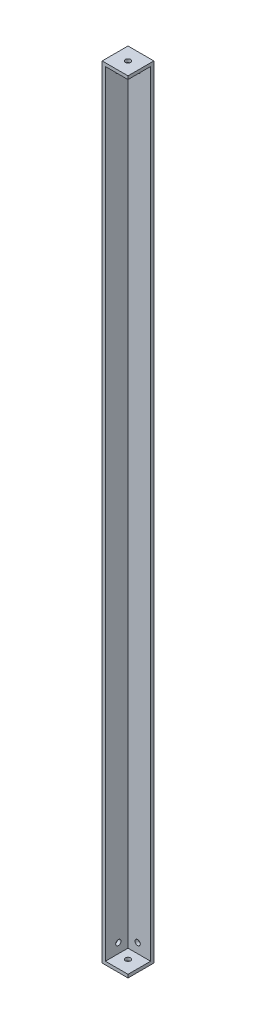
ISO-10303-21;
HEADER;
FILE_DESCRIPTION(('STEP AP214'),'2;1');
FILE_NAME('part.step','',(''),(''),'','','');
FILE_SCHEMA(('AUTOMOTIVE_DESIGN { 1 0 10303 214 1 1 1 1 }'));
ENDSEC;
DATA;
#1=APPLICATION_CONTEXT('core data for automotive mechanical design processes');
#2=APPLICATION_PROTOCOL_DEFINITION('international standard','automotive_design',2000,#1);
#3=PRODUCT_CONTEXT('',#1,'mechanical');
#4=PRODUCT('Part','Part','',(#3));
#5=PRODUCT_RELATED_PRODUCT_CATEGORY('part','',(#4));
#6=PRODUCT_DEFINITION_FORMATION('','',#4);
#7=PRODUCT_DEFINITION_CONTEXT('part definition',#1,'design');
#8=PRODUCT_DEFINITION('design','',#6,#7);
#9=PRODUCT_DEFINITION_SHAPE('','',#8);
#10=(LENGTH_UNIT() NAMED_UNIT(*) SI_UNIT(.MILLI.,.METRE.));
#11=(NAMED_UNIT(*) PLANE_ANGLE_UNIT() SI_UNIT($,.RADIAN.));
#12=(NAMED_UNIT(*) SI_UNIT($,.STERADIAN.) SOLID_ANGLE_UNIT());
#13=UNCERTAINTY_MEASURE_WITH_UNIT(LENGTH_MEASURE(1.E-05),#10,'distance_accuracy_value','');
#14=(GEOMETRIC_REPRESENTATION_CONTEXT(3) GLOBAL_UNCERTAINTY_ASSIGNED_CONTEXT((#13)) GLOBAL_UNIT_ASSIGNED_CONTEXT((#10,
#11,#12)) REPRESENTATION_CONTEXT('',''));
#15=CARTESIAN_POINT('',(0.,0.,0.));
#16=DIRECTION('',(0.,0.,1.));
#17=DIRECTION('',(1.,0.,0.));
#18=AXIS2_PLACEMENT_3D('',#15,#16,#17);
#19=CARTESIAN_POINT('',(0.,5.,0.));
#20=DIRECTION('',(0.,-1.,0.));
#21=DIRECTION('',(0.,0.,-1.));
#22=AXIS2_PLACEMENT_3D('',#19,#20,#21);
#23=PLANE('',#22);
#24=CARTESIAN_POINT('',(0.,5.,0.));
#25=DIRECTION('',(0.,1.,0.));
#26=DIRECTION('',(0.,0.,1.));
#27=AXIS2_PLACEMENT_3D('',#24,#25,#26);
#28=CIRCLE('',#27,4.05);
#29=CARTESIAN_POINT('',(0.,5.,4.05));
#30=VERTEX_POINT('',#29);
#31=EDGE_CURVE('E153',#30,#30,#28,.T.);
#32=ORIENTED_EDGE('',*,*,#31,.F.);
#33=EDGE_LOOP('',(#32));
#34=FACE_BOUND('',#33,.T.);
#35=DIRECTION('',(1.,0.,0.));
#36=VECTOR('',#35,1.);
#37=CARTESIAN_POINT('',(-15.,5.,-15.));
#38=LINE('',#37,#36);
#39=CARTESIAN_POINT('',(-15.,5.,-15.));
#40=VERTEX_POINT('',#39);
#41=CARTESIAN_POINT('',(20.,5.,-15.));
#42=VERTEX_POINT('',#41);
#43=EDGE_CURVE('E142',#40,#42,#38,.T.);
#44=ORIENTED_EDGE('',*,*,#43,.F.);
#45=DIRECTION('',(0.,0.,-1.));
#46=VECTOR('',#45,1.);
#47=CARTESIAN_POINT('',(-15.,5.,20.));
#48=LINE('',#47,#46);
#49=CARTESIAN_POINT('',(-15.,5.,20.));
#50=VERTEX_POINT('',#49);
#51=EDGE_CURVE('E55',#50,#40,#48,.T.);
#52=ORIENTED_EDGE('',*,*,#51,.F.);
#53=DIRECTION('',(1.,0.,0.));
#54=VECTOR('',#53,1.);
#55=CARTESIAN_POINT('',(20.,5.,20.));
#56=LINE('',#55,#54);
#57=CARTESIAN_POINT('',(20.,5.,20.));
#58=VERTEX_POINT('',#57);
#59=EDGE_CURVE('E159',#50,#58,#56,.T.);
#60=ORIENTED_EDGE('',*,*,#59,.T.);
#61=DIRECTION('',(0.,0.,-1.));
#62=VECTOR('',#61,1.);
#63=CARTESIAN_POINT('',(20.,5.,-20.));
#64=LINE('',#63,#62);
#65=EDGE_CURVE('E50',#58,#42,#64,.T.);
#66=ORIENTED_EDGE('',*,*,#65,.T.);
#67=EDGE_LOOP('',(#44,#52,#60,#66));
#68=FACE_BOUND('',#67,.T.);
#69=ADVANCED_FACE('F35',(#34,#68),#23,.F.);
#70=CARTESIAN_POINT('',(-20.,5.,20.));
#71=DIRECTION('',(1.,0.,0.));
#72=DIRECTION('',(0.,0.,-1.));
#73=AXIS2_PLACEMENT_3D('',#70,#71,#72);
#74=PLANE('',#73);
#75=CARTESIAN_POINT('',(-20.,1190.,0.));
#76=DIRECTION('',(-1.,0.,0.));
#77=DIRECTION('',(0.,0.,-1.));
#78=AXIS2_PLACEMENT_3D('',#75,#76,#77);
#79=CIRCLE('',#78,4.05);
#80=CARTESIAN_POINT('',(-20.,1190.,-4.05));
#81=VERTEX_POINT('',#80);
#82=EDGE_CURVE('E313',#81,#81,#79,.T.);
#83=ORIENTED_EDGE('',*,*,#82,.F.);
#84=EDGE_LOOP('',(#83));
#85=FACE_BOUND('',#84,.T.);
#86=CARTESIAN_POINT('',(-20.,20.,0.));
#87=DIRECTION('',(1.,0.,0.));
#88=DIRECTION('',(0.,0.,-1.));
#89=AXIS2_PLACEMENT_3D('',#86,#87,#88);
#90=CIRCLE('',#89,4.05);
#91=CARTESIAN_POINT('',(-20.,20.,-4.05));
#92=VERTEX_POINT('',#91);
#93=EDGE_CURVE('E320',#92,#92,#90,.T.);
#94=ORIENTED_EDGE('',*,*,#93,.T.);
#95=EDGE_LOOP('',(#94));
#96=FACE_BOUND('',#95,.T.);
#97=DIRECTION('',(0.,0.,1.));
#98=VECTOR('',#97,1.);
#99=CARTESIAN_POINT('',(-20.,0.,20.));
#100=LINE('',#99,#98);
#101=CARTESIAN_POINT('',(-20.,0.,-20.));
#102=VERTEX_POINT('',#101);
#103=CARTESIAN_POINT('',(-20.,0.,20.));
#104=VERTEX_POINT('',#103);
#105=EDGE_CURVE('E104',#102,#104,#100,.T.);
#106=ORIENTED_EDGE('',*,*,#105,.T.);
#107=DIRECTION('',(0.,-1.,0.));
#108=VECTOR('',#107,1.);
#109=CARTESIAN_POINT('',(-20.,5.,20.));
#110=LINE('',#109,#108);
#111=CARTESIAN_POINT('',(-20.,1210.,20.));
#112=VERTEX_POINT('',#111);
#113=EDGE_CURVE('E11',#112,#104,#110,.T.);
#114=ORIENTED_EDGE('',*,*,#113,.F.);
#115=DIRECTION('',(0.,0.,1.));
#116=VECTOR('',#115,1.);
#117=CARTESIAN_POINT('',(-20.,1210.,-20.));
#118=LINE('',#117,#116);
#119=CARTESIAN_POINT('',(-20.,1210.,-20.));
#120=VERTEX_POINT('',#119);
#121=EDGE_CURVE('E102',#120,#112,#118,.T.);
#122=ORIENTED_EDGE('',*,*,#121,.F.);
#123=DIRECTION('',(0.,-1.,0.));
#124=VECTOR('',#123,1.);
#125=CARTESIAN_POINT('',(-20.,5.,-20.));
#126=LINE('',#125,#124);
#127=EDGE_CURVE('E163',#120,#102,#126,.T.);
#128=ORIENTED_EDGE('',*,*,#127,.T.);
#129=EDGE_LOOP('',(#106,#114,#122,#128));
#130=FACE_BOUND('',#129,.T.);
#131=ADVANCED_FACE('F37',(#85,#96,#130),#74,.F.);
#132=CARTESIAN_POINT('',(20.,5.,20.));
#133=DIRECTION('',(0.,0.,-1.));
#134=DIRECTION('',(-1.,0.,0.));
#135=AXIS2_PLACEMENT_3D('',#132,#133,#134);
#136=PLANE('',#135);
#137=DIRECTION('',(1.,0.,0.));
#138=VECTOR('',#137,1.);
#139=CARTESIAN_POINT('',(20.,0.,20.));
#140=LINE('',#139,#138);
#141=CARTESIAN_POINT('',(20.,0.,20.));
#142=VERTEX_POINT('',#141);
#143=EDGE_CURVE('E165',#104,#142,#140,.T.);
#144=ORIENTED_EDGE('',*,*,#143,.T.);
#145=DIRECTION('',(0.,-1.,0.));
#146=VECTOR('',#145,1.);
#147=CARTESIAN_POINT('',(20.,5.,20.));
#148=LINE('',#147,#146);
#149=EDGE_CURVE('E43',#58,#142,#148,.T.);
#150=ORIENTED_EDGE('',*,*,#149,.F.);
#151=ORIENTED_EDGE('',*,*,#59,.F.);
#152=DIRECTION('',(0.,-1.,0.));
#153=VECTOR('',#152,1.);
#154=CARTESIAN_POINT('',(-15.,605.,20.));
#155=LINE('',#154,#153);
#156=CARTESIAN_POINT('',(-15.,1205.,20.));
#157=VERTEX_POINT('',#156);
#158=EDGE_CURVE('E150',#157,#50,#155,.T.);
#159=ORIENTED_EDGE('',*,*,#158,.F.);
#160=DIRECTION('',(1.,0.,0.));
#161=VECTOR('',#160,1.);
#162=CARTESIAN_POINT('',(-20.,1205.,20.));
#163=LINE('',#162,#161);
#164=CARTESIAN_POINT('',(20.,1205.,20.));
#165=VERTEX_POINT('',#164);
#166=EDGE_CURVE('E124',#157,#165,#163,.T.);
#167=ORIENTED_EDGE('',*,*,#166,.T.);
#168=DIRECTION('',(0.,-1.,0.));
#169=VECTOR('',#168,1.);
#170=CARTESIAN_POINT('',(20.,1210.,20.));
#171=LINE('',#170,#169);
#172=CARTESIAN_POINT('',(20.,1210.,20.));
#173=VERTEX_POINT('',#172);
#174=EDGE_CURVE('E110',#173,#165,#171,.T.);
#175=ORIENTED_EDGE('',*,*,#174,.F.);
#176=DIRECTION('',(1.,0.,0.));
#177=VECTOR('',#176,1.);
#178=CARTESIAN_POINT('',(-20.,1210.,20.));
#179=LINE('',#178,#177);
#180=EDGE_CURVE('E107',#112,#173,#179,.T.);
#181=ORIENTED_EDGE('',*,*,#180,.F.);
#182=ORIENTED_EDGE('',*,*,#113,.T.);
#183=EDGE_LOOP('',(#144,#150,#151,#159,#167,#175,#181,#182));
#184=FACE_BOUND('',#183,.T.);
#185=ADVANCED_FACE('F108',(#184),#136,.F.);
#186=CARTESIAN_POINT('',(20.,5.,-20.));
#187=DIRECTION('',(-1.,0.,0.));
#188=DIRECTION('',(0.,0.,1.));
#189=AXIS2_PLACEMENT_3D('',#186,#187,#188);
#190=PLANE('',#189);
#191=DIRECTION('',(0.,0.,-1.));
#192=VECTOR('',#191,1.);
#193=CARTESIAN_POINT('',(20.,0.,-20.));
#194=LINE('',#193,#192);
#195=CARTESIAN_POINT('',(20.,0.,-20.));
#196=VERTEX_POINT('',#195);
#197=EDGE_CURVE('E167',#142,#196,#194,.T.);
#198=ORIENTED_EDGE('',*,*,#197,.T.);
#199=DIRECTION('',(0.,-1.,0.));
#200=VECTOR('',#199,1.);
#201=CARTESIAN_POINT('',(20.,5.,-20.));
#202=LINE('',#201,#200);
#203=CARTESIAN_POINT('',(20.,1210.,-20.));
#204=VERTEX_POINT('',#203);
#205=EDGE_CURVE('E171',#204,#196,#202,.T.);
#206=ORIENTED_EDGE('',*,*,#205,.F.);
#207=DIRECTION('',(0.,0.,-1.));
#208=VECTOR('',#207,1.);
#209=CARTESIAN_POINT('',(20.,1210.,-20.));
#210=LINE('',#209,#208);
#211=EDGE_CURVE('E114',#173,#204,#210,.T.);
#212=ORIENTED_EDGE('',*,*,#211,.F.);
#213=ORIENTED_EDGE('',*,*,#174,.T.);
#214=DIRECTION('',(0.,0.,-1.));
#215=VECTOR('',#214,1.);
#216=CARTESIAN_POINT('',(20.,1205.,-20.));
#217=LINE('',#216,#215);
#218=CARTESIAN_POINT('',(20.,1205.,-15.));
#219=VERTEX_POINT('',#218);
#220=EDGE_CURVE('E121',#165,#219,#217,.T.);
#221=ORIENTED_EDGE('',*,*,#220,.T.);
#222=DIRECTION('',(0.,-1.,0.));
#223=VECTOR('',#222,1.);
#224=CARTESIAN_POINT('',(20.,605.,-15.));
#225=LINE('',#224,#223);
#226=EDGE_CURVE('E144',#219,#42,#225,.T.);
#227=ORIENTED_EDGE('',*,*,#226,.T.);
#228=ORIENTED_EDGE('',*,*,#65,.F.);
#229=ORIENTED_EDGE('',*,*,#149,.T.);
#230=EDGE_LOOP('',(#198,#206,#212,#213,#221,#227,#228,#229));
#231=FACE_BOUND('',#230,.T.);
#232=ADVANCED_FACE('F177',(#231),#190,.F.);
#233=CARTESIAN_POINT('',(-20.,5.,-20.));
#234=DIRECTION('',(0.,0.,1.));
#235=DIRECTION('',(1.,0.,0.));
#236=AXIS2_PLACEMENT_3D('',#233,#234,#235);
#237=PLANE('',#236);
#238=CARTESIAN_POINT('',(0.,1190.,-20.));
#239=DIRECTION('',(0.,0.,-1.));
#240=DIRECTION('',(1.,0.,0.));
#241=AXIS2_PLACEMENT_3D('',#238,#239,#240);
#242=CIRCLE('',#241,4.05);
#243=CARTESIAN_POINT('',(4.05,1190.,-20.));
#244=VERTEX_POINT('',#243);
#245=EDGE_CURVE('E326',#244,#244,#242,.T.);
#246=ORIENTED_EDGE('',*,*,#245,.F.);
#247=EDGE_LOOP('',(#246));
#248=FACE_BOUND('',#247,.T.);
#249=CARTESIAN_POINT('',(0.,20.,-20.));
#250=DIRECTION('',(0.,0.,1.));
#251=DIRECTION('',(1.,0.,0.));
#252=AXIS2_PLACEMENT_3D('',#249,#250,#251);
#253=CIRCLE('',#252,4.05);
#254=CARTESIAN_POINT('',(4.05,20.,-20.));
#255=VERTEX_POINT('',#254);
#256=EDGE_CURVE('E332',#255,#255,#253,.T.);
#257=ORIENTED_EDGE('',*,*,#256,.T.);
#258=EDGE_LOOP('',(#257));
#259=FACE_BOUND('',#258,.T.);
#260=DIRECTION('',(-1.,0.,0.));
#261=VECTOR('',#260,1.);
#262=CARTESIAN_POINT('',(-20.,0.,-20.));
#263=LINE('',#262,#261);
#264=EDGE_CURVE('E161',#196,#102,#263,.T.);
#265=ORIENTED_EDGE('',*,*,#264,.T.);
#266=ORIENTED_EDGE('',*,*,#127,.F.);
#267=DIRECTION('',(-1.,0.,0.));
#268=VECTOR('',#267,1.);
#269=CARTESIAN_POINT('',(-20.,1210.,-20.));
#270=LINE('',#269,#268);
#271=EDGE_CURVE('E120',#204,#120,#270,.T.);
#272=ORIENTED_EDGE('',*,*,#271,.F.);
#273=ORIENTED_EDGE('',*,*,#205,.T.);
#274=EDGE_LOOP('',(#265,#266,#272,#273));
#275=FACE_BOUND('',#274,.T.);
#276=ADVANCED_FACE('F182',(#248,#259,#275),#237,.F.);
#277=CARTESIAN_POINT('',(0.,0.,0.));
#278=DIRECTION('',(0.,-1.,0.));
#279=DIRECTION('',(0.,0.,-1.));
#280=AXIS2_PLACEMENT_3D('',#277,#278,#279);
#281=PLANE('',#280);
#282=CARTESIAN_POINT('',(0.,0.,0.));
#283=DIRECTION('',(0.,1.,0.));
#284=DIRECTION('',(0.,0.,1.));
#285=AXIS2_PLACEMENT_3D('',#282,#283,#284);
#286=CIRCLE('',#285,4.05);
#287=CARTESIAN_POINT('',(0.,0.,4.05));
#288=VERTEX_POINT('',#287);
#289=EDGE_CURVE('E154',#288,#288,#286,.T.);
#290=ORIENTED_EDGE('',*,*,#289,.T.);
#291=EDGE_LOOP('',(#290));
#292=FACE_BOUND('',#291,.T.);
#293=ORIENTED_EDGE('',*,*,#105,.F.);
#294=ORIENTED_EDGE('',*,*,#264,.F.);
#295=ORIENTED_EDGE('',*,*,#197,.F.);
#296=ORIENTED_EDGE('',*,*,#143,.F.);
#297=EDGE_LOOP('',(#293,#294,#295,#296));
#298=FACE_BOUND('',#297,.T.);
#299=ADVANCED_FACE('F180',(#292,#298),#281,.T.);
#300=CARTESIAN_POINT('',(0.,0.,0.));
#301=DIRECTION('',(0.,1.,0.));
#302=DIRECTION('',(0.,0.,1.));
#303=AXIS2_PLACEMENT_3D('',#300,#301,#302);
#304=CYLINDRICAL_SURFACE('',#303,4.05);
#305=ORIENTED_EDGE('',*,*,#289,.F.);
#306=EDGE_LOOP('',(#305));
#307=FACE_BOUND('',#306,.T.);
#308=ORIENTED_EDGE('',*,*,#31,.T.);
#309=EDGE_LOOP('',(#308));
#310=FACE_BOUND('',#309,.T.);
#311=ADVANCED_FACE('F194',(#307,#310),#304,.F.);
#312=CARTESIAN_POINT('',(-15.,605.,20.));
#313=DIRECTION('',(-1.,0.,0.));
#314=DIRECTION('',(0.,0.,1.));
#315=AXIS2_PLACEMENT_3D('',#312,#313,#314);
#316=PLANE('',#315);
#317=CARTESIAN_POINT('',(-15.,1190.,0.));
#318=DIRECTION('',(-1.,0.,0.));
#319=DIRECTION('',(0.,0.,-1.));
#320=AXIS2_PLACEMENT_3D('',#317,#318,#319);
#321=CIRCLE('',#320,4.05);
#322=CARTESIAN_POINT('',(-15.,1190.,-4.05));
#323=VERTEX_POINT('',#322);
#324=EDGE_CURVE('E315',#323,#323,#321,.T.);
#325=ORIENTED_EDGE('',*,*,#324,.T.);
#326=EDGE_LOOP('',(#325));
#327=FACE_BOUND('',#326,.T.);
#328=CARTESIAN_POINT('',(-15.,20.,0.));
#329=DIRECTION('',(1.,0.,0.));
#330=DIRECTION('',(0.,0.,-1.));
#331=AXIS2_PLACEMENT_3D('',#328,#329,#330);
#332=CIRCLE('',#331,4.05);
#333=CARTESIAN_POINT('',(-15.,20.,-4.05));
#334=VERTEX_POINT('',#333);
#335=EDGE_CURVE('E317',#334,#334,#332,.T.);
#336=ORIENTED_EDGE('',*,*,#335,.F.);
#337=EDGE_LOOP('',(#336));
#338=FACE_BOUND('',#337,.T.);
#339=ORIENTED_EDGE('',*,*,#51,.T.);
#340=DIRECTION('',(0.,-1.,0.));
#341=VECTOR('',#340,1.);
#342=CARTESIAN_POINT('',(-15.,605.,-15.));
#343=LINE('',#342,#341);
#344=CARTESIAN_POINT('',(-15.,1205.,-15.));
#345=VERTEX_POINT('',#344);
#346=EDGE_CURVE('E147',#345,#40,#343,.T.);
#347=ORIENTED_EDGE('',*,*,#346,.F.);
#348=DIRECTION('',(0.,0.,-1.));
#349=VECTOR('',#348,1.);
#350=CARTESIAN_POINT('',(-15.,1205.,20.));
#351=LINE('',#350,#349);
#352=EDGE_CURVE('E138',#157,#345,#351,.T.);
#353=ORIENTED_EDGE('',*,*,#352,.F.);
#354=ORIENTED_EDGE('',*,*,#158,.T.);
#355=EDGE_LOOP('',(#339,#347,#353,#354));
#356=FACE_BOUND('',#355,.T.);
#357=ADVANCED_FACE('F192',(#327,#338,#356),#316,.F.);
#358=CARTESIAN_POINT('',(-15.,605.,-15.));
#359=DIRECTION('',(0.,0.,-1.));
#360=DIRECTION('',(-1.,0.,0.));
#361=AXIS2_PLACEMENT_3D('',#358,#359,#360);
#362=PLANE('',#361);
#363=CARTESIAN_POINT('',(0.,1190.,-15.));
#364=DIRECTION('',(0.,0.,-1.));
#365=DIRECTION('',(1.,0.,0.));
#366=AXIS2_PLACEMENT_3D('',#363,#364,#365);
#367=CIRCLE('',#366,4.05);
#368=CARTESIAN_POINT('',(4.05,1190.,-15.));
#369=VERTEX_POINT('',#368);
#370=EDGE_CURVE('E323',#369,#369,#367,.T.);
#371=ORIENTED_EDGE('',*,*,#370,.T.);
#372=EDGE_LOOP('',(#371));
#373=FACE_BOUND('',#372,.T.);
#374=CARTESIAN_POINT('',(0.,20.,-15.));
#375=DIRECTION('',(0.,0.,1.));
#376=DIRECTION('',(1.,0.,0.));
#377=AXIS2_PLACEMENT_3D('',#374,#375,#376);
#378=CIRCLE('',#377,4.05);
#379=CARTESIAN_POINT('',(4.05,20.,-15.));
#380=VERTEX_POINT('',#379);
#381=EDGE_CURVE('E329',#380,#380,#378,.T.);
#382=ORIENTED_EDGE('',*,*,#381,.F.);
#383=EDGE_LOOP('',(#382));
#384=FACE_BOUND('',#383,.T.);
#385=ORIENTED_EDGE('',*,*,#43,.T.);
#386=ORIENTED_EDGE('',*,*,#226,.F.);
#387=DIRECTION('',(1.,0.,0.));
#388=VECTOR('',#387,1.);
#389=CARTESIAN_POINT('',(-15.,1205.,-15.));
#390=LINE('',#389,#388);
#391=EDGE_CURVE('E135',#345,#219,#390,.T.);
#392=ORIENTED_EDGE('',*,*,#391,.F.);
#393=ORIENTED_EDGE('',*,*,#346,.T.);
#394=EDGE_LOOP('',(#385,#386,#392,#393));
#395=FACE_BOUND('',#394,.T.);
#396=ADVANCED_FACE('F190',(#373,#384,#395),#362,.F.);
#397=CARTESIAN_POINT('',(0.,1205.,0.));
#398=DIRECTION('',(0.,1.,0.));
#399=DIRECTION('',(0.,0.,1.));
#400=AXIS2_PLACEMENT_3D('',#397,#398,#399);
#401=PLANE('',#400);
#402=CARTESIAN_POINT('',(0.,1205.,0.));
#403=DIRECTION('',(0.,1.,0.));
#404=DIRECTION('',(0.,0.,1.));
#405=AXIS2_PLACEMENT_3D('',#402,#403,#404);
#406=CIRCLE('',#405,4.05);
#407=CARTESIAN_POINT('',(0.,1205.,4.05));
#408=VERTEX_POINT('',#407);
#409=EDGE_CURVE('E127',#408,#408,#406,.T.);
#410=ORIENTED_EDGE('',*,*,#409,.T.);
#411=EDGE_LOOP('',(#410));
#412=FACE_BOUND('',#411,.T.);
#413=ORIENTED_EDGE('',*,*,#166,.F.);
#414=ORIENTED_EDGE('',*,*,#352,.T.);
#415=ORIENTED_EDGE('',*,*,#391,.T.);
#416=ORIENTED_EDGE('',*,*,#220,.F.);
#417=EDGE_LOOP('',(#413,#414,#415,#416));
#418=FACE_BOUND('',#417,.T.);
#419=ADVANCED_FACE('F186',(#412,#418),#401,.F.);
#420=CARTESIAN_POINT('',(0.,1210.,0.));
#421=DIRECTION('',(0.,1.,0.));
#422=DIRECTION('',(0.,0.,1.));
#423=AXIS2_PLACEMENT_3D('',#420,#421,#422);
#424=PLANE('',#423);
#425=ORIENTED_EDGE('',*,*,#121,.T.);
#426=ORIENTED_EDGE('',*,*,#180,.T.);
#427=ORIENTED_EDGE('',*,*,#211,.T.);
#428=ORIENTED_EDGE('',*,*,#271,.T.);
#429=EDGE_LOOP('',(#425,#426,#427,#428));
#430=FACE_BOUND('',#429,.T.);
#431=CARTESIAN_POINT('',(0.,1210.,0.));
#432=DIRECTION('',(0.,1.,0.));
#433=DIRECTION('',(0.,0.,1.));
#434=AXIS2_PLACEMENT_3D('',#431,#432,#433);
#435=CIRCLE('',#434,4.05);
#436=CARTESIAN_POINT('',(0.,1210.,4.05));
#437=VERTEX_POINT('',#436);
#438=EDGE_CURVE('E132',#437,#437,#435,.T.);
#439=ORIENTED_EDGE('',*,*,#438,.F.);
#440=EDGE_LOOP('',(#439));
#441=FACE_BOUND('',#440,.T.);
#442=ADVANCED_FACE('F117',(#430,#441),#424,.T.);
#443=CARTESIAN_POINT('',(0.,1210.,0.));
#444=DIRECTION('',(0.,-1.,0.));
#445=DIRECTION('',(0.,0.,-1.));
#446=AXIS2_PLACEMENT_3D('',#443,#444,#445);
#447=CYLINDRICAL_SURFACE('',#446,4.05);
#448=ORIENTED_EDGE('',*,*,#438,.T.);
#449=EDGE_LOOP('',(#448));
#450=FACE_BOUND('',#449,.T.);
#451=ORIENTED_EDGE('',*,*,#409,.F.);
#452=EDGE_LOOP('',(#451));
#453=FACE_BOUND('',#452,.T.);
#454=ADVANCED_FACE('F256',(#450,#453),#447,.F.);
#455=CARTESIAN_POINT('',(0.,20.,-20.));
#456=DIRECTION('',(0.,0.,1.));
#457=DIRECTION('',(1.,0.,0.));
#458=AXIS2_PLACEMENT_3D('',#455,#456,#457);
#459=CYLINDRICAL_SURFACE('',#458,4.05);
#460=ORIENTED_EDGE('',*,*,#256,.F.);
#461=EDGE_LOOP('',(#460));
#462=FACE_BOUND('',#461,.T.);
#463=ORIENTED_EDGE('',*,*,#381,.T.);
#464=EDGE_LOOP('',(#463));
#465=FACE_BOUND('',#464,.T.);
#466=ADVANCED_FACE('F263',(#462,#465),#459,.F.);
#467=CARTESIAN_POINT('',(0.,1190.,-20.));
#468=DIRECTION('',(0.,0.,1.));
#469=DIRECTION('',(1.,0.,0.));
#470=AXIS2_PLACEMENT_3D('',#467,#468,#469);
#471=CYLINDRICAL_SURFACE('',#470,4.05);
#472=ORIENTED_EDGE('',*,*,#245,.T.);
#473=EDGE_LOOP('',(#472));
#474=FACE_BOUND('',#473,.T.);
#475=ORIENTED_EDGE('',*,*,#370,.F.);
#476=EDGE_LOOP('',(#475));
#477=FACE_BOUND('',#476,.T.);
#478=ADVANCED_FACE('F270',(#474,#477),#471,.F.);
#479=CARTESIAN_POINT('',(-20.,20.,0.));
#480=DIRECTION('',(1.,0.,0.));
#481=DIRECTION('',(0.,0.,-1.));
#482=AXIS2_PLACEMENT_3D('',#479,#480,#481);
#483=CYLINDRICAL_SURFACE('',#482,4.05);
#484=ORIENTED_EDGE('',*,*,#93,.F.);
#485=EDGE_LOOP('',(#484));
#486=FACE_BOUND('',#485,.T.);
#487=ORIENTED_EDGE('',*,*,#335,.T.);
#488=EDGE_LOOP('',(#487));
#489=FACE_BOUND('',#488,.T.);
#490=ADVANCED_FACE('F278',(#486,#489),#483,.F.);
#491=CARTESIAN_POINT('',(-20.,1190.,0.));
#492=DIRECTION('',(1.,0.,0.));
#493=DIRECTION('',(0.,0.,-1.));
#494=AXIS2_PLACEMENT_3D('',#491,#492,#493);
#495=CYLINDRICAL_SURFACE('',#494,4.05);
#496=ORIENTED_EDGE('',*,*,#82,.T.);
#497=EDGE_LOOP('',(#496));
#498=FACE_BOUND('',#497,.T.);
#499=ORIENTED_EDGE('',*,*,#324,.F.);
#500=EDGE_LOOP('',(#499));
#501=FACE_BOUND('',#500,.T.);
#502=ADVANCED_FACE('F286',(#498,#501),#495,.F.);
#503=CLOSED_SHELL('',(#69,#131,#185,#232,#276,#299,#311,#357,#396,#419,#442,#454,#466,#478,#490,#502));
#504=MANIFOLD_SOLID_BREP('B2',#503);
#505=ADVANCED_BREP_SHAPE_REPRESENTATION('',(#18,#504),#14);
#506=SHAPE_DEFINITION_REPRESENTATION(#9,#505);
ENDSEC;
END-ISO-10303-21;
